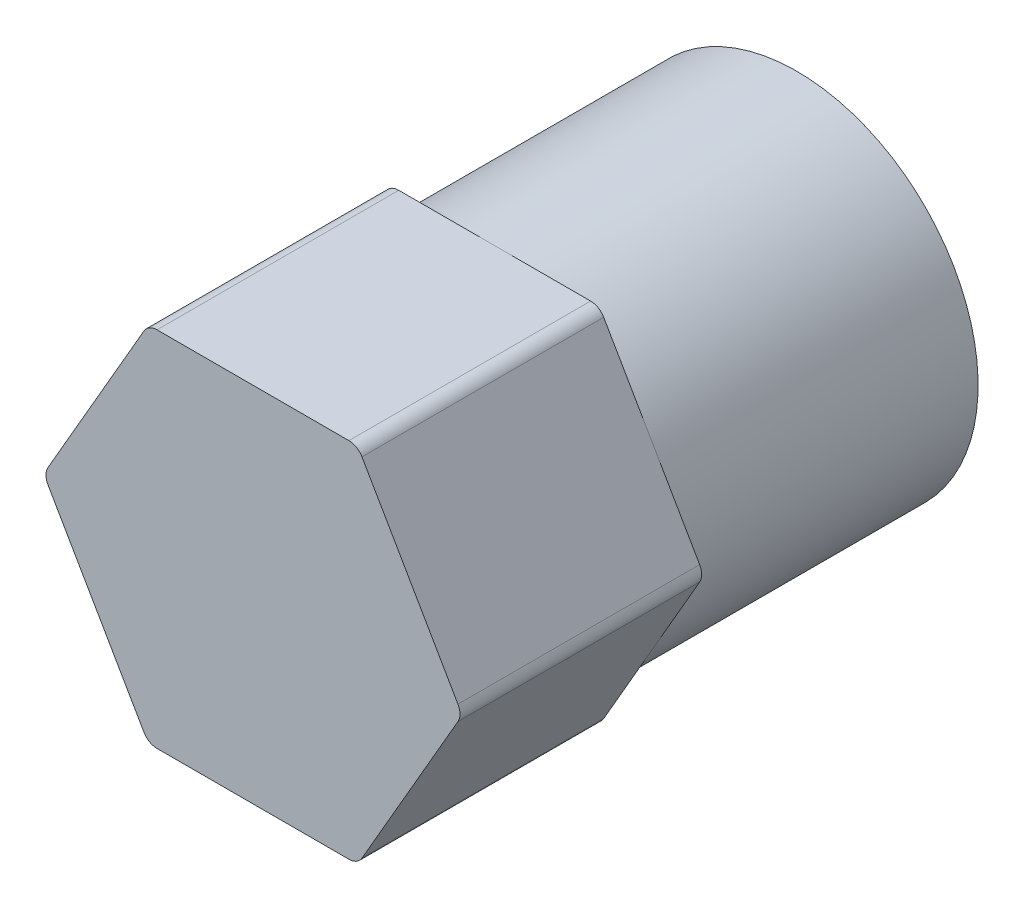
ISO-10303-21;
HEADER;
FILE_DESCRIPTION(('STEP AP214'),'2;1');
FILE_NAME('part.step','',(''),(''),'','','');
FILE_SCHEMA(('AUTOMOTIVE_DESIGN { 1 0 10303 214 1 1 1 1 }'));
ENDSEC;
DATA;
#1=APPLICATION_CONTEXT('core data for automotive mechanical design processes');
#2=APPLICATION_PROTOCOL_DEFINITION('international standard','automotive_design',2000,#1);
#3=PRODUCT_CONTEXT('',#1,'mechanical');
#4=PRODUCT('Part','Part','',(#3));
#5=PRODUCT_RELATED_PRODUCT_CATEGORY('part','',(#4));
#6=PRODUCT_DEFINITION_FORMATION('','',#4);
#7=PRODUCT_DEFINITION_CONTEXT('part definition',#1,'design');
#8=PRODUCT_DEFINITION('design','',#6,#7);
#9=PRODUCT_DEFINITION_SHAPE('','',#8);
#10=(LENGTH_UNIT() NAMED_UNIT(*) SI_UNIT(.MILLI.,.METRE.));
#11=(NAMED_UNIT(*) PLANE_ANGLE_UNIT() SI_UNIT($,.RADIAN.));
#12=(NAMED_UNIT(*) SI_UNIT($,.STERADIAN.) SOLID_ANGLE_UNIT());
#13=UNCERTAINTY_MEASURE_WITH_UNIT(LENGTH_MEASURE(1.E-05),#10,'distance_accuracy_value','');
#14=(GEOMETRIC_REPRESENTATION_CONTEXT(3) GLOBAL_UNCERTAINTY_ASSIGNED_CONTEXT((#13)) GLOBAL_UNIT_ASSIGNED_CONTEXT((#10,
#11,#12)) REPRESENTATION_CONTEXT('',''));
#15=CARTESIAN_POINT('',(0.,0.,0.));
#16=DIRECTION('',(0.,0.,1.));
#17=DIRECTION('',(1.,0.,0.));
#18=AXIS2_PLACEMENT_3D('',#15,#16,#17);
#19=CARTESIAN_POINT('',(0.,0.,0.));
#20=DIRECTION('',(0.,0.,1.));
#21=DIRECTION('',(1.,0.,0.));
#22=AXIS2_PLACEMENT_3D('',#19,#20,#21);
#23=PLANE('',#22);
#24=DIRECTION('',(-0.5,-0.866025403784438,0.));
#25=VECTOR('',#24,1.);
#26=CARTESIAN_POINT('',(-3.46410161513775,6.,0.));
#27=LINE('',#26,#25);
#28=CARTESIAN_POINT('',(-3.60843918243516,5.75,0.));
#29=VERTEX_POINT('',#28);
#30=CARTESIAN_POINT('',(-5.19615242270663,3.,0.));
#31=VERTEX_POINT('',#30);
#32=EDGE_CURVE('E242',#29,#31,#27,.T.);
#33=ORIENTED_EDGE('',*,*,#32,.F.);
#34=CARTESIAN_POINT('',(-3.17542648054294,5.5,0.));
#35=DIRECTION('',(0.,0.,1.));
#36=DIRECTION('',(1.,0.,0.));
#37=AXIS2_PLACEMENT_3D('',#34,#35,#36);
#38=CIRCLE('',#37,0.5);
#39=CARTESIAN_POINT('',(-3.17542648054294,6.,0.));
#40=VERTEX_POINT('',#39);
#41=EDGE_CURVE('E11',#29,#40,#38,.F.);
#42=ORIENTED_EDGE('',*,*,#41,.T.);
#43=DIRECTION('',(-1.,0.,0.));
#44=VECTOR('',#43,1.);
#45=CARTESIAN_POINT('',(-3.46410161513775,6.,0.));
#46=LINE('',#45,#44);
#47=CARTESIAN_POINT('',(0.,6.,0.));
#48=VERTEX_POINT('',#47);
#49=EDGE_CURVE('E237',#48,#40,#46,.T.);
#50=ORIENTED_EDGE('',*,*,#49,.F.);
#51=CARTESIAN_POINT('',(0.,0.,0.));
#52=DIRECTION('',(0.,0.,-1.));
#53=DIRECTION('',(-1.,0.,0.));
#54=AXIS2_PLACEMENT_3D('',#51,#52,#53);
#55=CIRCLE('',#54,6.);
#56=EDGE_CURVE('E193',#31,#48,#55,.T.);
#57=ORIENTED_EDGE('',*,*,#56,.F.);
#58=EDGE_LOOP('',(#33,#42,#50,#57));
#59=FACE_BOUND('',#58,.T.);
#60=ADVANCED_FACE('F45',(#59),#23,.F.);
#61=CARTESIAN_POINT('',(3.17542648054294,6.,0.));
#62=VERTEX_POINT('',#61);
#63=EDGE_CURVE('E238',#62,#48,#46,.T.);
#64=ORIENTED_EDGE('',*,*,#63,.F.);
#65=CARTESIAN_POINT('',(3.17542648054294,5.5,0.));
#66=DIRECTION('',(0.,0.,1.));
#67=DIRECTION('',(1.,0.,0.));
#68=AXIS2_PLACEMENT_3D('',#65,#66,#67);
#69=CIRCLE('',#68,0.5);
#70=CARTESIAN_POINT('',(3.60843918243516,5.75,0.));
#71=VERTEX_POINT('',#70);
#72=EDGE_CURVE('E54',#62,#71,#69,.F.);
#73=ORIENTED_EDGE('',*,*,#72,.T.);
#74=DIRECTION('',(-0.5,0.866025403784439,0.));
#75=VECTOR('',#74,1.);
#76=CARTESIAN_POINT('',(3.46410161513775,6.,0.));
#77=LINE('',#76,#75);
#78=CARTESIAN_POINT('',(5.19615242270663,3.,0.));
#79=VERTEX_POINT('',#78);
#80=EDGE_CURVE('E233',#79,#71,#77,.T.);
#81=ORIENTED_EDGE('',*,*,#80,.F.);
#82=EDGE_CURVE('E203',#48,#79,#55,.T.);
#83=ORIENTED_EDGE('',*,*,#82,.F.);
#84=EDGE_LOOP('',(#64,#73,#81,#83));
#85=FACE_BOUND('',#84,.T.);
#86=ADVANCED_FACE('F327',(#85),#23,.F.);
#87=CARTESIAN_POINT('',(6.7838656629781,0.249999999999999,0.));
#88=VERTEX_POINT('',#87);
#89=EDGE_CURVE('E234',#88,#79,#77,.T.);
#90=ORIENTED_EDGE('',*,*,#89,.F.);
#91=CARTESIAN_POINT('',(6.35085296108588,0.,0.));
#92=DIRECTION('',(0.,0.,1.));
#93=DIRECTION('',(1.,0.,0.));
#94=AXIS2_PLACEMENT_3D('',#91,#92,#93);
#95=CIRCLE('',#94,0.5);
#96=CARTESIAN_POINT('',(6.7838656629781,-0.25,0.));
#97=VERTEX_POINT('',#96);
#98=EDGE_CURVE('E314',#88,#97,#95,.F.);
#99=ORIENTED_EDGE('',*,*,#98,.T.);
#100=DIRECTION('',(0.5,0.866025403784438,0.));
#101=VECTOR('',#100,1.);
#102=CARTESIAN_POINT('',(6.92820323027551,0.,0.));
#103=LINE('',#102,#101);
#104=CARTESIAN_POINT('',(5.19615242270663,-3.,0.));
#105=VERTEX_POINT('',#104);
#106=EDGE_CURVE('E199',#105,#97,#103,.T.);
#107=ORIENTED_EDGE('',*,*,#106,.F.);
#108=EDGE_CURVE('E393',#79,#105,#55,.T.);
#109=ORIENTED_EDGE('',*,*,#108,.F.);
#110=EDGE_LOOP('',(#90,#99,#107,#109));
#111=FACE_BOUND('',#110,.T.);
#112=ADVANCED_FACE('F391',(#111),#23,.F.);
#113=CARTESIAN_POINT('',(3.60843918243516,-5.75,0.));
#114=VERTEX_POINT('',#113);
#115=EDGE_CURVE('E230',#114,#105,#103,.T.);
#116=ORIENTED_EDGE('',*,*,#115,.F.);
#117=CARTESIAN_POINT('',(3.17542648054294,-5.5,0.));
#118=DIRECTION('',(0.,0.,1.));
#119=DIRECTION('',(1.,0.,0.));
#120=AXIS2_PLACEMENT_3D('',#117,#118,#119);
#121=CIRCLE('',#120,0.5);
#122=CARTESIAN_POINT('',(3.17542648054294,-6.,0.));
#123=VERTEX_POINT('',#122);
#124=EDGE_CURVE('E304',#114,#123,#121,.F.);
#125=ORIENTED_EDGE('',*,*,#124,.T.);
#126=DIRECTION('',(1.,0.,0.));
#127=VECTOR('',#126,1.);
#128=CARTESIAN_POINT('',(-3.46410161513775,-6.,0.));
#129=LINE('',#128,#127);
#130=CARTESIAN_POINT('',(0.,-6.,0.));
#131=VERTEX_POINT('',#130);
#132=EDGE_CURVE('E249',#131,#123,#129,.T.);
#133=ORIENTED_EDGE('',*,*,#132,.F.);
#134=EDGE_CURVE('E397',#105,#131,#55,.T.);
#135=ORIENTED_EDGE('',*,*,#134,.F.);
#136=EDGE_LOOP('',(#116,#125,#133,#135));
#137=FACE_BOUND('',#136,.T.);
#138=ADVANCED_FACE('F420',(#137),#23,.F.);
#139=CARTESIAN_POINT('',(-3.17542648054294,-6.,0.));
#140=VERTEX_POINT('',#139);
#141=EDGE_CURVE('E210',#140,#131,#129,.T.);
#142=ORIENTED_EDGE('',*,*,#141,.F.);
#143=CARTESIAN_POINT('',(-3.17542648054294,-5.5,0.));
#144=DIRECTION('',(0.,0.,1.));
#145=DIRECTION('',(1.,0.,0.));
#146=AXIS2_PLACEMENT_3D('',#143,#144,#145);
#147=CIRCLE('',#146,0.5);
#148=CARTESIAN_POINT('',(-3.60843918243516,-5.75,0.));
#149=VERTEX_POINT('',#148);
#150=EDGE_CURVE('E294',#140,#149,#147,.F.);
#151=ORIENTED_EDGE('',*,*,#150,.T.);
#152=DIRECTION('',(0.5,-0.866025403784439,0.));
#153=VECTOR('',#152,1.);
#154=CARTESIAN_POINT('',(-6.92820323027551,0.,0.));
#155=LINE('',#154,#153);
#156=CARTESIAN_POINT('',(-5.19615242270663,-3.,0.));
#157=VERTEX_POINT('',#156);
#158=EDGE_CURVE('E245',#157,#149,#155,.T.);
#159=ORIENTED_EDGE('',*,*,#158,.F.);
#160=EDGE_CURVE('E400',#131,#157,#55,.T.);
#161=ORIENTED_EDGE('',*,*,#160,.F.);
#162=EDGE_LOOP('',(#142,#151,#159,#161));
#163=FACE_BOUND('',#162,.T.);
#164=ADVANCED_FACE('F413',(#163),#23,.F.);
#165=CARTESIAN_POINT('',(6.92820323027551,0.,8.));
#166=DIRECTION('',(-0.866025403784439,0.5,0.));
#167=DIRECTION('',(-0.5,-0.866025403784438,0.));
#168=AXIS2_PLACEMENT_3D('',#165,#166,#167);
#169=PLANE('',#168);
#170=DIRECTION('',(0.5,0.866025403784438,0.));
#171=VECTOR('',#170,1.);
#172=CARTESIAN_POINT('',(6.92820323027551,0.,8.));
#173=LINE('',#172,#171);
#174=CARTESIAN_POINT('',(3.60843918243516,-5.75,8.));
#175=VERTEX_POINT('',#174);
#176=CARTESIAN_POINT('',(6.7838656629781,-0.25,8.));
#177=VERTEX_POINT('',#176);
#178=EDGE_CURVE('E205',#175,#177,#173,.T.);
#179=ORIENTED_EDGE('',*,*,#178,.F.);
#180=DIRECTION('',(0.,0.,-1.));
#181=VECTOR('',#180,1.);
#182=CARTESIAN_POINT('',(3.60843918243516,-5.75,8.));
#183=LINE('',#182,#181);
#184=EDGE_CURVE('E300',#175,#114,#183,.T.);
#185=ORIENTED_EDGE('',*,*,#184,.T.);
#186=ORIENTED_EDGE('',*,*,#115,.T.);
#187=ORIENTED_EDGE('',*,*,#106,.T.);
#188=DIRECTION('',(0.,0.,-1.));
#189=VECTOR('',#188,1.);
#190=CARTESIAN_POINT('',(6.7838656629781,-0.25,8.));
#191=LINE('',#190,#189);
#192=EDGE_CURVE('E297',#97,#177,#191,.F.);
#193=ORIENTED_EDGE('',*,*,#192,.T.);
#194=EDGE_LOOP('',(#179,#185,#186,#187,#193));
#195=FACE_BOUND('',#194,.T.);
#196=ADVANCED_FACE('F382',(#195),#169,.F.);
#197=CARTESIAN_POINT('',(3.46410161513775,6.,8.));
#198=DIRECTION('',(-0.866025403784439,-0.5,0.));
#199=DIRECTION('',(0.5,-0.866025403784439,0.));
#200=AXIS2_PLACEMENT_3D('',#197,#198,#199);
#201=PLANE('',#200);
#202=DIRECTION('',(-0.5,0.866025403784439,0.));
#203=VECTOR('',#202,1.);
#204=CARTESIAN_POINT('',(3.46410161513775,6.,8.));
#205=LINE('',#204,#203);
#206=CARTESIAN_POINT('',(6.7838656629781,0.249999999999999,8.));
#207=VERTEX_POINT('',#206);
#208=CARTESIAN_POINT('',(3.60843918243516,5.75,8.));
#209=VERTEX_POINT('',#208);
#210=EDGE_CURVE('E209',#207,#209,#205,.T.);
#211=ORIENTED_EDGE('',*,*,#210,.F.);
#212=DIRECTION('',(0.,0.,-1.));
#213=VECTOR('',#212,1.);
#214=CARTESIAN_POINT('',(6.7838656629781,0.249999999999999,8.));
#215=LINE('',#214,#213);
#216=EDGE_CURVE('E310',#207,#88,#215,.T.);
#217=ORIENTED_EDGE('',*,*,#216,.T.);
#218=ORIENTED_EDGE('',*,*,#89,.T.);
#219=ORIENTED_EDGE('',*,*,#80,.T.);
#220=DIRECTION('',(0.,0.,-1.));
#221=VECTOR('',#220,1.);
#222=CARTESIAN_POINT('',(3.60843918243516,5.75,8.));
#223=LINE('',#222,#221);
#224=EDGE_CURVE('E307',#71,#209,#223,.F.);
#225=ORIENTED_EDGE('',*,*,#224,.T.);
#226=EDGE_LOOP('',(#211,#217,#218,#219,#225));
#227=FACE_BOUND('',#226,.T.);
#228=ADVANCED_FACE('F332',(#227),#201,.F.);
#229=CARTESIAN_POINT('',(-3.46410161513775,6.,8.));
#230=DIRECTION('',(0.,-1.,0.));
#231=DIRECTION('',(1.,0.,0.));
#232=AXIS2_PLACEMENT_3D('',#229,#230,#231);
#233=PLANE('',#232);
#234=DIRECTION('',(-1.,0.,0.));
#235=VECTOR('',#234,1.);
#236=CARTESIAN_POINT('',(-3.46410161513775,6.,8.));
#237=LINE('',#236,#235);
#238=CARTESIAN_POINT('',(3.17542648054294,6.,8.));
#239=VERTEX_POINT('',#238);
#240=CARTESIAN_POINT('',(-3.17542648054294,6.,8.));
#241=VERTEX_POINT('',#240);
#242=EDGE_CURVE('E214',#239,#241,#237,.T.);
#243=ORIENTED_EDGE('',*,*,#242,.F.);
#244=DIRECTION('',(0.,0.,-1.));
#245=VECTOR('',#244,1.);
#246=CARTESIAN_POINT('',(3.17542648054294,6.,8.));
#247=LINE('',#246,#245);
#248=EDGE_CURVE('E320',#239,#62,#247,.T.);
#249=ORIENTED_EDGE('',*,*,#248,.T.);
#250=ORIENTED_EDGE('',*,*,#63,.T.);
#251=ORIENTED_EDGE('',*,*,#49,.T.);
#252=DIRECTION('',(0.,0.,-1.));
#253=VECTOR('',#252,1.);
#254=CARTESIAN_POINT('',(-3.17542648054294,6.,8.));
#255=LINE('',#254,#253);
#256=EDGE_CURVE('E317',#40,#241,#255,.F.);
#257=ORIENTED_EDGE('',*,*,#256,.T.);
#258=EDGE_LOOP('',(#243,#249,#250,#251,#257));
#259=FACE_BOUND('',#258,.T.);
#260=ADVANCED_FACE('F343',(#259),#233,.F.);
#261=CARTESIAN_POINT('',(-3.46410161513775,6.,8.));
#262=DIRECTION('',(0.866025403784439,-0.5,0.));
#263=DIRECTION('',(0.5,0.866025403784439,0.));
#264=AXIS2_PLACEMENT_3D('',#261,#262,#263);
#265=PLANE('',#264);
#266=CARTESIAN_POINT('',(-6.7838656629781,0.250000000000009,0.));
#267=VERTEX_POINT('',#266);
#268=EDGE_CURVE('E241',#31,#267,#27,.T.);
#269=ORIENTED_EDGE('',*,*,#268,.T.);
#270=DIRECTION('',(0.,0.,-1.));
#271=VECTOR('',#270,1.);
#272=CARTESIAN_POINT('',(-6.7838656629781,0.250000000000007,8.));
#273=LINE('',#272,#271);
#274=CARTESIAN_POINT('',(-6.7838656629781,0.250000000000009,8.));
#275=VERTEX_POINT('',#274);
#276=EDGE_CURVE('E266',#267,#275,#273,.F.);
#277=ORIENTED_EDGE('',*,*,#276,.T.);
#278=DIRECTION('',(-0.5,-0.866025403784438,0.));
#279=VECTOR('',#278,1.);
#280=CARTESIAN_POINT('',(-3.46410161513775,6.,8.));
#281=LINE('',#280,#279);
#282=CARTESIAN_POINT('',(-3.60843918243516,5.75,8.));
#283=VERTEX_POINT('',#282);
#284=EDGE_CURVE('E218',#283,#275,#281,.T.);
#285=ORIENTED_EDGE('',*,*,#284,.F.);
#286=DIRECTION('',(0.,0.,-1.));
#287=VECTOR('',#286,1.);
#288=CARTESIAN_POINT('',(-3.60843918243516,5.75,8.));
#289=LINE('',#288,#287);
#290=EDGE_CURVE('E262',#283,#29,#289,.T.);
#291=ORIENTED_EDGE('',*,*,#290,.T.);
#292=ORIENTED_EDGE('',*,*,#32,.T.);
#293=EDGE_LOOP('',(#269,#277,#285,#291,#292));
#294=FACE_BOUND('',#293,.T.);
#295=ADVANCED_FACE('F351',(#294),#265,.F.);
#296=CARTESIAN_POINT('',(-6.92820323027551,0.,8.));
#297=DIRECTION('',(0.866025403784439,0.5,0.));
#298=DIRECTION('',(-0.5,0.866025403784439,0.));
#299=AXIS2_PLACEMENT_3D('',#296,#297,#298);
#300=PLANE('',#299);
#301=DIRECTION('',(0.5,-0.866025403784439,0.));
#302=VECTOR('',#301,1.);
#303=CARTESIAN_POINT('',(-6.92820323027551,0.,8.));
#304=LINE('',#303,#302);
#305=CARTESIAN_POINT('',(-6.7838656629781,-0.249999999999994,8.));
#306=VERTEX_POINT('',#305);
#307=CARTESIAN_POINT('',(-3.60843918243516,-5.75,8.));
#308=VERTEX_POINT('',#307);
#309=EDGE_CURVE('E222',#306,#308,#304,.T.);
#310=ORIENTED_EDGE('',*,*,#309,.F.);
#311=DIRECTION('',(0.,0.,-1.));
#312=VECTOR('',#311,1.);
#313=CARTESIAN_POINT('',(-6.7838656629781,-0.249999999999994,8.));
#314=LINE('',#313,#312);
#315=CARTESIAN_POINT('',(-6.7838656629781,-0.249999999999994,0.));
#316=VERTEX_POINT('',#315);
#317=EDGE_CURVE('E255',#306,#316,#314,.T.);
#318=ORIENTED_EDGE('',*,*,#317,.T.);
#319=EDGE_CURVE('E246',#316,#157,#155,.T.);
#320=ORIENTED_EDGE('',*,*,#319,.T.);
#321=ORIENTED_EDGE('',*,*,#158,.T.);
#322=DIRECTION('',(0.,0.,-1.));
#323=VECTOR('',#322,1.);
#324=CARTESIAN_POINT('',(-3.60843918243516,-5.75,8.));
#325=LINE('',#324,#323);
#326=EDGE_CURVE('E252',#149,#308,#325,.F.);
#327=ORIENTED_EDGE('',*,*,#326,.T.);
#328=EDGE_LOOP('',(#310,#318,#320,#321,#327));
#329=FACE_BOUND('',#328,.T.);
#330=ADVANCED_FACE('F360',(#329),#300,.F.);
#331=CARTESIAN_POINT('',(-3.46410161513775,-6.,8.));
#332=DIRECTION('',(0.,1.,0.));
#333=DIRECTION('',(-1.,0.,0.));
#334=AXIS2_PLACEMENT_3D('',#331,#332,#333);
#335=PLANE('',#334);
#336=DIRECTION('',(1.,0.,0.));
#337=VECTOR('',#336,1.);
#338=CARTESIAN_POINT('',(-3.46410161513775,-6.,8.));
#339=LINE('',#338,#337);
#340=CARTESIAN_POINT('',(-3.17542648054294,-6.,8.));
#341=VERTEX_POINT('',#340);
#342=CARTESIAN_POINT('',(3.17542648054294,-6.,8.));
#343=VERTEX_POINT('',#342);
#344=EDGE_CURVE('E226',#341,#343,#339,.T.);
#345=ORIENTED_EDGE('',*,*,#344,.F.);
#346=DIRECTION('',(0.,0.,-1.));
#347=VECTOR('',#346,1.);
#348=CARTESIAN_POINT('',(-3.17542648054294,-6.,8.));
#349=LINE('',#348,#347);
#350=EDGE_CURVE('E290',#341,#140,#349,.T.);
#351=ORIENTED_EDGE('',*,*,#350,.T.);
#352=ORIENTED_EDGE('',*,*,#141,.T.);
#353=ORIENTED_EDGE('',*,*,#132,.T.);
#354=DIRECTION('',(0.,0.,-1.));
#355=VECTOR('',#354,1.);
#356=CARTESIAN_POINT('',(3.17542648054294,-6.,8.));
#357=LINE('',#356,#355);
#358=EDGE_CURVE('E287',#123,#343,#357,.F.);
#359=ORIENTED_EDGE('',*,*,#358,.T.);
#360=EDGE_LOOP('',(#345,#351,#352,#353,#359));
#361=FACE_BOUND('',#360,.T.);
#362=ADVANCED_FACE('F371',(#361),#335,.F.);
#363=CARTESIAN_POINT('',(0.,0.,8.));
#364=DIRECTION('',(0.,0.,1.));
#365=DIRECTION('',(1.,0.,0.));
#366=AXIS2_PLACEMENT_3D('',#363,#364,#365);
#367=PLANE('',#366);
#368=ORIENTED_EDGE('',*,*,#284,.T.);
#369=CARTESIAN_POINT('',(-6.35085296108588,0.,8.));
#370=DIRECTION('',(0.,0.,1.));
#371=DIRECTION('',(1.,0.,0.));
#372=AXIS2_PLACEMENT_3D('',#369,#370,#371);
#373=CIRCLE('',#372,0.5);
#374=EDGE_CURVE('E284',#275,#306,#373,.T.);
#375=ORIENTED_EDGE('',*,*,#374,.T.);
#376=ORIENTED_EDGE('',*,*,#309,.T.);
#377=CARTESIAN_POINT('',(-3.17542648054294,-5.5,8.));
#378=DIRECTION('',(0.,0.,1.));
#379=DIRECTION('',(1.,0.,0.));
#380=AXIS2_PLACEMENT_3D('',#377,#378,#379);
#381=CIRCLE('',#380,0.5);
#382=EDGE_CURVE('E281',#308,#341,#381,.T.);
#383=ORIENTED_EDGE('',*,*,#382,.T.);
#384=ORIENTED_EDGE('',*,*,#344,.T.);
#385=CARTESIAN_POINT('',(3.17542648054294,-5.5,8.));
#386=DIRECTION('',(0.,0.,1.));
#387=DIRECTION('',(1.,0.,0.));
#388=AXIS2_PLACEMENT_3D('',#385,#386,#387);
#389=CIRCLE('',#388,0.5);
#390=EDGE_CURVE('E278',#343,#175,#389,.T.);
#391=ORIENTED_EDGE('',*,*,#390,.T.);
#392=ORIENTED_EDGE('',*,*,#178,.T.);
#393=CARTESIAN_POINT('',(6.35085296108588,0.,8.));
#394=DIRECTION('',(0.,0.,1.));
#395=DIRECTION('',(1.,0.,0.));
#396=AXIS2_PLACEMENT_3D('',#393,#394,#395);
#397=CIRCLE('',#396,0.5);
#398=EDGE_CURVE('E275',#177,#207,#397,.T.);
#399=ORIENTED_EDGE('',*,*,#398,.T.);
#400=ORIENTED_EDGE('',*,*,#210,.T.);
#401=CARTESIAN_POINT('',(3.17542648054294,5.5,8.));
#402=DIRECTION('',(0.,0.,1.));
#403=DIRECTION('',(1.,0.,0.));
#404=AXIS2_PLACEMENT_3D('',#401,#402,#403);
#405=CIRCLE('',#404,0.5);
#406=EDGE_CURVE('E272',#209,#239,#405,.T.);
#407=ORIENTED_EDGE('',*,*,#406,.T.);
#408=ORIENTED_EDGE('',*,*,#242,.T.);
#409=CARTESIAN_POINT('',(-3.17542648054294,5.5,8.));
#410=DIRECTION('',(0.,0.,1.));
#411=DIRECTION('',(1.,0.,0.));
#412=AXIS2_PLACEMENT_3D('',#409,#410,#411);
#413=CIRCLE('',#412,0.5);
#414=EDGE_CURVE('E269',#241,#283,#413,.T.);
#415=ORIENTED_EDGE('',*,*,#414,.T.);
#416=EDGE_LOOP('',(#368,#375,#376,#383,#384,#391,#392,#399,#400,#407,#408,#415));
#417=FACE_BOUND('',#416,.T.);
#418=ADVANCED_FACE('F340',(#417),#367,.T.);
#419=ORIENTED_EDGE('',*,*,#319,.F.);
#420=CARTESIAN_POINT('',(-6.35085296108588,0.,0.));
#421=DIRECTION('',(0.,0.,1.));
#422=DIRECTION('',(1.,0.,0.));
#423=AXIS2_PLACEMENT_3D('',#420,#421,#422);
#424=CIRCLE('',#423,0.5);
#425=EDGE_CURVE('E259',#316,#267,#424,.F.);
#426=ORIENTED_EDGE('',*,*,#425,.T.);
#427=ORIENTED_EDGE('',*,*,#268,.F.);
#428=EDGE_CURVE('E204',#157,#31,#55,.T.);
#429=ORIENTED_EDGE('',*,*,#428,.F.);
#430=EDGE_LOOP('',(#419,#426,#427,#429));
#431=FACE_BOUND('',#430,.T.);
#432=ADVANCED_FACE('F411',(#431),#23,.F.);
#433=CARTESIAN_POINT('',(0.,0.,-10.));
#434=DIRECTION('',(0.,0.,1.));
#435=DIRECTION('',(1.,0.,0.));
#436=AXIS2_PLACEMENT_3D('',#433,#434,#435);
#437=CYLINDRICAL_SURFACE('',#436,6.);
#438=CARTESIAN_POINT('',(0.,0.,-10.));
#439=DIRECTION('',(0.,0.,-1.));
#440=DIRECTION('',(-1.,0.,0.));
#441=AXIS2_PLACEMENT_3D('',#438,#439,#440);
#442=CIRCLE('',#441,6.);
#443=CARTESIAN_POINT('',(-6.,0.,-10.));
#444=VERTEX_POINT('',#443);
#445=EDGE_CURVE('E195',#444,#444,#442,.T.);
#446=ORIENTED_EDGE('',*,*,#445,.F.);
#447=EDGE_LOOP('',(#446));
#448=FACE_BOUND('',#447,.T.);
#449=ORIENTED_EDGE('',*,*,#56,.T.);
#450=ORIENTED_EDGE('',*,*,#82,.T.);
#451=ORIENTED_EDGE('',*,*,#108,.T.);
#452=ORIENTED_EDGE('',*,*,#134,.T.);
#453=ORIENTED_EDGE('',*,*,#160,.T.);
#454=ORIENTED_EDGE('',*,*,#428,.T.);
#455=EDGE_LOOP('',(#449,#450,#451,#452,#453,#454));
#456=FACE_BOUND('',#455,.T.);
#457=ADVANCED_FACE('F408',(#448,#456),#437,.T.);
#458=CARTESIAN_POINT('',(0.,0.,-10.));
#459=DIRECTION('',(0.,0.,-1.));
#460=DIRECTION('',(-1.,0.,0.));
#461=AXIS2_PLACEMENT_3D('',#458,#459,#460);
#462=PLANE('',#461);
#463=CARTESIAN_POINT('',(0.,0.,-10.));
#464=DIRECTION('',(0.,0.,-1.));
#465=DIRECTION('',(-1.,0.,0.));
#466=AXIS2_PLACEMENT_3D('',#463,#464,#465);
#467=CIRCLE('',#466,2.);
#468=CARTESIAN_POINT('',(1.35,1.47563545633737,-10.));
#469=VERTEX_POINT('',#468);
#470=CARTESIAN_POINT('',(-1.35,1.47563545633737,-10.));
#471=VERTEX_POINT('',#470);
#472=EDGE_CURVE('E170',#469,#471,#467,.T.);
#473=ORIENTED_EDGE('',*,*,#472,.F.);
#474=DIRECTION('',(1.,0.,0.));
#475=VECTOR('',#474,1.);
#476=CARTESIAN_POINT('',(1.35,1.47563545633737,-10.));
#477=LINE('',#476,#475);
#478=EDGE_CURVE('E182',#471,#469,#477,.T.);
#479=ORIENTED_EDGE('',*,*,#478,.F.);
#480=EDGE_LOOP('',(#473,#479));
#481=FACE_BOUND('',#480,.T.);
#482=ORIENTED_EDGE('',*,*,#445,.T.);
#483=EDGE_LOOP('',(#482));
#484=FACE_BOUND('',#483,.T.);
#485=ADVANCED_FACE('F440',(#481,#484),#462,.T.);
#486=CARTESIAN_POINT('',(0.,0.,-2.));
#487=DIRECTION('',(0.,0.,-1.));
#488=DIRECTION('',(-1.,0.,0.));
#489=AXIS2_PLACEMENT_3D('',#486,#487,#488);
#490=CYLINDRICAL_SURFACE('',#489,2.);
#491=ORIENTED_EDGE('',*,*,#472,.T.);
#492=DIRECTION('',(0.,0.,-1.));
#493=VECTOR('',#492,1.);
#494=CARTESIAN_POINT('',(-1.35,1.47563545633737,-2.));
#495=LINE('',#494,#493);
#496=CARTESIAN_POINT('',(-1.35,1.47563545633737,-2.));
#497=VERTEX_POINT('',#496);
#498=EDGE_CURVE('E164',#497,#471,#495,.T.);
#499=ORIENTED_EDGE('',*,*,#498,.F.);
#500=CARTESIAN_POINT('',(0.,0.,-2.));
#501=DIRECTION('',(0.,0.,-1.));
#502=DIRECTION('',(-1.,0.,0.));
#503=AXIS2_PLACEMENT_3D('',#500,#501,#502);
#504=CIRCLE('',#503,2.);
#505=CARTESIAN_POINT('',(1.35,1.47563545633737,-2.));
#506=VERTEX_POINT('',#505);
#507=EDGE_CURVE('E167',#506,#497,#504,.T.);
#508=ORIENTED_EDGE('',*,*,#507,.F.);
#509=DIRECTION('',(0.,0.,-1.));
#510=VECTOR('',#509,1.);
#511=CARTESIAN_POINT('',(1.35,1.47563545633737,-2.));
#512=LINE('',#511,#510);
#513=EDGE_CURVE('E176',#506,#469,#512,.T.);
#514=ORIENTED_EDGE('',*,*,#513,.T.);
#515=EDGE_LOOP('',(#491,#499,#508,#514));
#516=FACE_BOUND('',#515,.T.);
#517=ADVANCED_FACE('F166',(#516),#490,.F.);
#518=CARTESIAN_POINT('',(1.35,1.47563545633737,-2.));
#519=DIRECTION('',(0.,1.,0.));
#520=DIRECTION('',(0.,0.,1.));
#521=AXIS2_PLACEMENT_3D('',#518,#519,#520);
#522=PLANE('',#521);
#523=ORIENTED_EDGE('',*,*,#478,.T.);
#524=ORIENTED_EDGE('',*,*,#513,.F.);
#525=DIRECTION('',(1.,0.,0.));
#526=VECTOR('',#525,1.);
#527=CARTESIAN_POINT('',(1.35,1.47563545633737,-2.));
#528=LINE('',#527,#526);
#529=EDGE_CURVE('E177',#497,#506,#528,.T.);
#530=ORIENTED_EDGE('',*,*,#529,.F.);
#531=ORIENTED_EDGE('',*,*,#498,.T.);
#532=EDGE_LOOP('',(#523,#524,#530,#531));
#533=FACE_BOUND('',#532,.T.);
#534=ADVANCED_FACE('F184',(#533),#522,.F.);
#535=CARTESIAN_POINT('',(0.,0.,-2.));
#536=DIRECTION('',(0.,0.,-1.));
#537=DIRECTION('',(-1.,0.,0.));
#538=AXIS2_PLACEMENT_3D('',#535,#536,#537);
#539=PLANE('',#538);
#540=ORIENTED_EDGE('',*,*,#507,.T.);
#541=ORIENTED_EDGE('',*,*,#529,.T.);
#542=EDGE_LOOP('',(#540,#541));
#543=FACE_BOUND('',#542,.T.);
#544=ADVANCED_FACE('F180',(#543),#539,.T.);
#545=CARTESIAN_POINT('',(-6.35085296108588,0.,8.));
#546=DIRECTION('',(0.,0.,-1.));
#547=DIRECTION('',(-1.,0.,0.));
#548=AXIS2_PLACEMENT_3D('',#545,#546,#547);
#549=CYLINDRICAL_SURFACE('',#548,0.5);
#550=ORIENTED_EDGE('',*,*,#374,.F.);
#551=ORIENTED_EDGE('',*,*,#276,.F.);
#552=ORIENTED_EDGE('',*,*,#425,.F.);
#553=ORIENTED_EDGE('',*,*,#317,.F.);
#554=EDGE_LOOP('',(#550,#551,#552,#553));
#555=FACE_BOUND('',#554,.T.);
#556=ADVANCED_FACE('F355',(#555),#549,.T.);
#557=CARTESIAN_POINT('',(-3.17542648054294,-5.5,8.));
#558=DIRECTION('',(0.,0.,-1.));
#559=DIRECTION('',(-1.,0.,0.));
#560=AXIS2_PLACEMENT_3D('',#557,#558,#559);
#561=CYLINDRICAL_SURFACE('',#560,0.5);
#562=ORIENTED_EDGE('',*,*,#382,.F.);
#563=ORIENTED_EDGE('',*,*,#326,.F.);
#564=ORIENTED_EDGE('',*,*,#150,.F.);
#565=ORIENTED_EDGE('',*,*,#350,.F.);
#566=EDGE_LOOP('',(#562,#563,#564,#565));
#567=FACE_BOUND('',#566,.T.);
#568=ADVANCED_FACE('F366',(#567),#561,.T.);
#569=CARTESIAN_POINT('',(3.17542648054294,-5.5,8.));
#570=DIRECTION('',(0.,0.,-1.));
#571=DIRECTION('',(-1.,0.,0.));
#572=AXIS2_PLACEMENT_3D('',#569,#570,#571);
#573=CYLINDRICAL_SURFACE('',#572,0.5);
#574=ORIENTED_EDGE('',*,*,#390,.F.);
#575=ORIENTED_EDGE('',*,*,#358,.F.);
#576=ORIENTED_EDGE('',*,*,#124,.F.);
#577=ORIENTED_EDGE('',*,*,#184,.F.);
#578=EDGE_LOOP('',(#574,#575,#576,#577));
#579=FACE_BOUND('',#578,.T.);
#580=ADVANCED_FACE('F377',(#579),#573,.T.);
#581=CARTESIAN_POINT('',(6.35085296108588,0.,8.));
#582=DIRECTION('',(0.,0.,-1.));
#583=DIRECTION('',(-1.,0.,0.));
#584=AXIS2_PLACEMENT_3D('',#581,#582,#583);
#585=CYLINDRICAL_SURFACE('',#584,0.5);
#586=ORIENTED_EDGE('',*,*,#398,.F.);
#587=ORIENTED_EDGE('',*,*,#192,.F.);
#588=ORIENTED_EDGE('',*,*,#98,.F.);
#589=ORIENTED_EDGE('',*,*,#216,.F.);
#590=EDGE_LOOP('',(#586,#587,#588,#589));
#591=FACE_BOUND('',#590,.T.);
#592=ADVANCED_FACE('F388',(#591),#585,.T.);
#593=CARTESIAN_POINT('',(3.17542648054294,5.5,8.));
#594=DIRECTION('',(0.,0.,-1.));
#595=DIRECTION('',(-1.,0.,0.));
#596=AXIS2_PLACEMENT_3D('',#593,#594,#595);
#597=CYLINDRICAL_SURFACE('',#596,0.5);
#598=ORIENTED_EDGE('',*,*,#406,.F.);
#599=ORIENTED_EDGE('',*,*,#224,.F.);
#600=ORIENTED_EDGE('',*,*,#72,.F.);
#601=ORIENTED_EDGE('',*,*,#248,.F.);
#602=EDGE_LOOP('',(#598,#599,#600,#601));
#603=FACE_BOUND('',#602,.T.);
#604=ADVANCED_FACE('F337',(#603),#597,.T.);
#605=CARTESIAN_POINT('',(-3.17542648054294,5.5,8.));
#606=DIRECTION('',(0.,0.,-1.));
#607=DIRECTION('',(-1.,0.,0.));
#608=AXIS2_PLACEMENT_3D('',#605,#606,#607);
#609=CYLINDRICAL_SURFACE('',#608,0.5);
#610=ORIENTED_EDGE('',*,*,#414,.F.);
#611=ORIENTED_EDGE('',*,*,#256,.F.);
#612=ORIENTED_EDGE('',*,*,#41,.F.);
#613=ORIENTED_EDGE('',*,*,#290,.F.);
#614=EDGE_LOOP('',(#610,#611,#612,#613));
#615=FACE_BOUND('',#614,.T.);
#616=ADVANCED_FACE('F47',(#615),#609,.T.);
#617=CLOSED_SHELL('',(#60,#86,#112,#138,#164,#196,#228,#260,#295,#330,#362,#418,#432,#457,#485,
#517,#534,#544,#556,#568,#580,#592,#604,#616));
#618=MANIFOLD_SOLID_BREP('B2',#617);
#619=ADVANCED_BREP_SHAPE_REPRESENTATION('',(#18,#618),#14);
#620=SHAPE_DEFINITION_REPRESENTATION(#9,#619);
ENDSEC;
END-ISO-10303-21;
